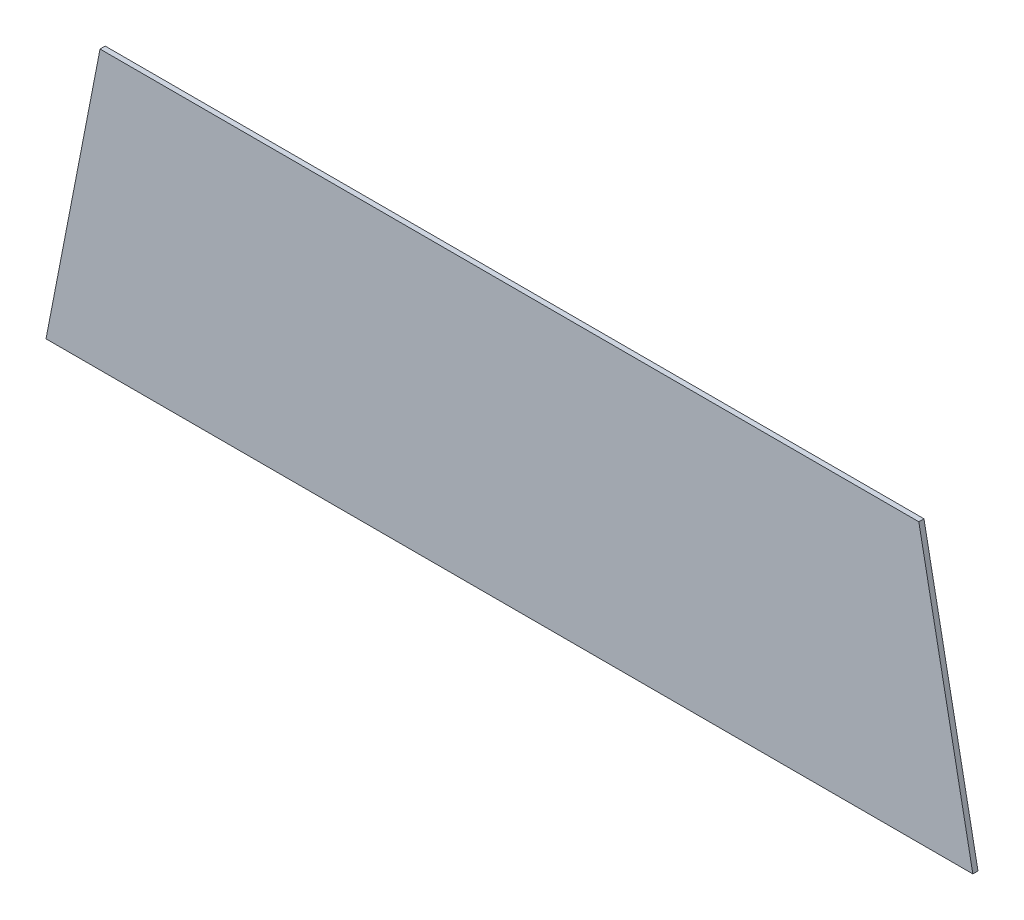
ISO-10303-21;
HEADER;
FILE_DESCRIPTION(('STEP AP214'),'2;1');
FILE_NAME('part.step','',(''),(''),'','','');
FILE_SCHEMA(('AUTOMOTIVE_DESIGN { 1 0 10303 214 1 1 1 1 }'));
ENDSEC;
DATA;
#1=APPLICATION_CONTEXT('core data for automotive mechanical design processes');
#2=APPLICATION_PROTOCOL_DEFINITION('international standard','automotive_design',2000,#1);
#3=PRODUCT_CONTEXT('',#1,'mechanical');
#4=PRODUCT('Part','Part','',(#3));
#5=PRODUCT_RELATED_PRODUCT_CATEGORY('part','',(#4));
#6=PRODUCT_DEFINITION_FORMATION('','',#4);
#7=PRODUCT_DEFINITION_CONTEXT('part definition',#1,'design');
#8=PRODUCT_DEFINITION('design','',#6,#7);
#9=PRODUCT_DEFINITION_SHAPE('','',#8);
#10=(LENGTH_UNIT() NAMED_UNIT(*) SI_UNIT(.MILLI.,.METRE.));
#11=(NAMED_UNIT(*) PLANE_ANGLE_UNIT() SI_UNIT($,.RADIAN.));
#12=(NAMED_UNIT(*) SI_UNIT($,.STERADIAN.) SOLID_ANGLE_UNIT());
#13=UNCERTAINTY_MEASURE_WITH_UNIT(LENGTH_MEASURE(1.E-05),#10,'distance_accuracy_value','');
#14=(GEOMETRIC_REPRESENTATION_CONTEXT(3) GLOBAL_UNCERTAINTY_ASSIGNED_CONTEXT((#13)) GLOBAL_UNIT_ASSIGNED_CONTEXT((#10,
#11,#12)) REPRESENTATION_CONTEXT('',''));
#15=CARTESIAN_POINT('',(0.,0.,0.));
#16=DIRECTION('',(0.,0.,1.));
#17=DIRECTION('',(1.,0.,0.));
#18=AXIS2_PLACEMENT_3D('',#15,#16,#17);
#19=CARTESIAN_POINT('',(-0.8999982,-0.26994612,0.01));
#20=DIRECTION('',(0.,0.,1.));
#21=DIRECTION('',(1.,0.,0.));
#22=AXIS2_PLACEMENT_3D('',#19,#20,#21);
#23=PLANE('',#22);
#24=DIRECTION('',(-1.,0.,0.));
#25=VECTOR('',#24,1.);
#26=CARTESIAN_POINT('',(-0.8999982,0.26994866,0.01));
#27=LINE('',#26,#25);
#28=CARTESIAN_POINT('',(0.79505556,0.26994866,0.01));
#29=VERTEX_POINT('',#28);
#30=CARTESIAN_POINT('',(-0.79505302,0.26994866,0.01));
#31=VERTEX_POINT('',#30);
#32=EDGE_CURVE('E107',#29,#31,#27,.T.);
#33=ORIENTED_EDGE('',*,*,#32,.T.);
#34=DIRECTION('',(-0.190809460987009,-0.981627092942043,0.));
#35=VECTOR('',#34,1.);
#36=CARTESIAN_POINT('',(-0.79505302,0.26994866,0.01));
#37=LINE('',#36,#35);
#38=CARTESIAN_POINT('',(-0.8999982,-0.26994612,0.01));
#39=VERTEX_POINT('',#38);
#40=EDGE_CURVE('E74',#31,#39,#37,.T.);
#41=ORIENTED_EDGE('',*,*,#40,.T.);
#42=DIRECTION('',(-1.,0.,0.));
#43=VECTOR('',#42,1.);
#44=CARTESIAN_POINT('',(0.90000074,-0.26994612,0.01));
#45=LINE('',#44,#43);
#46=CARTESIAN_POINT('',(0.90000074,-0.26994612,0.01));
#47=VERTEX_POINT('',#46);
#48=EDGE_CURVE('E11',#47,#39,#45,.T.);
#49=ORIENTED_EDGE('',*,*,#48,.F.);
#50=DIRECTION('',(-0.190809460987009,0.981627092942043,0.));
#51=VECTOR('',#50,1.);
#52=CARTESIAN_POINT('',(0.90000074,-0.26994612,0.01));
#53=LINE('',#52,#51);
#54=EDGE_CURVE('E27',#47,#29,#53,.T.);
#55=ORIENTED_EDGE('',*,*,#54,.T.);
#56=EDGE_LOOP('',(#33,#41,#49,#55));
#57=FACE_BOUND('',#56,.T.);
#58=ADVANCED_FACE('F16',(#57),#23,.T.);
#59=CARTESIAN_POINT('',(0.90000074,-0.26994612,0.));
#60=DIRECTION('',(0.,-1.,0.));
#61=DIRECTION('',(0.,0.,-1.));
#62=AXIS2_PLACEMENT_3D('',#59,#60,#61);
#63=PLANE('',#62);
#64=DIRECTION('',(0.,0.,1.));
#65=VECTOR('',#64,1.);
#66=CARTESIAN_POINT('',(-0.8999982,-0.26994612,0.));
#67=LINE('',#66,#65);
#68=CARTESIAN_POINT('',(-0.8999982,-0.26994612,0.));
#69=VERTEX_POINT('',#68);
#70=EDGE_CURVE('E76',#69,#39,#67,.T.);
#71=ORIENTED_EDGE('',*,*,#70,.F.);
#72=DIRECTION('',(1.,0.,0.));
#73=VECTOR('',#72,1.);
#74=CARTESIAN_POINT('',(-0.8999982,-0.26994612,0.));
#75=LINE('',#74,#73);
#76=CARTESIAN_POINT('',(0.90000074,-0.26994612,0.));
#77=VERTEX_POINT('',#76);
#78=EDGE_CURVE('E84',#69,#77,#75,.T.);
#79=ORIENTED_EDGE('',*,*,#78,.T.);
#80=DIRECTION('',(0.,0.,-1.));
#81=VECTOR('',#80,1.);
#82=CARTESIAN_POINT('',(0.90000074,-0.26994612,0.));
#83=LINE('',#82,#81);
#84=EDGE_CURVE('E97',#47,#77,#83,.T.);
#85=ORIENTED_EDGE('',*,*,#84,.F.);
#86=ORIENTED_EDGE('',*,*,#48,.T.);
#87=EDGE_LOOP('',(#71,#79,#85,#86));
#88=FACE_BOUND('',#87,.T.);
#89=ADVANCED_FACE('F124',(#88),#63,.T.);
#90=CARTESIAN_POINT('',(0.79505556,0.26994866,0.));
#91=DIRECTION('',(0.981627092942043,0.190809460987009,0.));
#92=DIRECTION('',(0.,0.,-1.));
#93=AXIS2_PLACEMENT_3D('',#90,#91,#92);
#94=PLANE('',#93);
#95=ORIENTED_EDGE('',*,*,#84,.T.);
#96=DIRECTION('',(-0.190809460987009,0.981627092942043,0.));
#97=VECTOR('',#96,1.);
#98=CARTESIAN_POINT('',(0.90000074,-0.26994612,0.));
#99=LINE('',#98,#97);
#100=CARTESIAN_POINT('',(0.79505556,0.26994866,0.));
#101=VERTEX_POINT('',#100);
#102=EDGE_CURVE('E88',#77,#101,#99,.T.);
#103=ORIENTED_EDGE('',*,*,#102,.T.);
#104=DIRECTION('',(0.,0.,-1.));
#105=VECTOR('',#104,1.);
#106=CARTESIAN_POINT('',(0.79505556,0.26994866,0.));
#107=LINE('',#106,#105);
#108=EDGE_CURVE('E20',#29,#101,#107,.T.);
#109=ORIENTED_EDGE('',*,*,#108,.F.);
#110=ORIENTED_EDGE('',*,*,#54,.F.);
#111=EDGE_LOOP('',(#95,#103,#109,#110));
#112=FACE_BOUND('',#111,.T.);
#113=ADVANCED_FACE('F122',(#112),#94,.T.);
#114=CARTESIAN_POINT('',(-0.79505302,0.26994866,0.));
#115=DIRECTION('',(0.,1.,0.));
#116=DIRECTION('',(1.,0.,0.));
#117=AXIS2_PLACEMENT_3D('',#114,#115,#116);
#118=PLANE('',#117);
#119=ORIENTED_EDGE('',*,*,#108,.T.);
#120=DIRECTION('',(-1.,0.,0.));
#121=VECTOR('',#120,1.);
#122=CARTESIAN_POINT('',(-0.8999982,0.26994866,0.));
#123=LINE('',#122,#121);
#124=CARTESIAN_POINT('',(-0.79505302,0.26994866,0.));
#125=VERTEX_POINT('',#124);
#126=EDGE_CURVE('E82',#101,#125,#123,.T.);
#127=ORIENTED_EDGE('',*,*,#126,.T.);
#128=DIRECTION('',(0.,0.,-1.));
#129=VECTOR('',#128,1.);
#130=CARTESIAN_POINT('',(-0.79505302,0.26994866,0.));
#131=LINE('',#130,#129);
#132=EDGE_CURVE('E69',#31,#125,#131,.T.);
#133=ORIENTED_EDGE('',*,*,#132,.F.);
#134=ORIENTED_EDGE('',*,*,#32,.F.);
#135=EDGE_LOOP('',(#119,#127,#133,#134));
#136=FACE_BOUND('',#135,.T.);
#137=ADVANCED_FACE('F86',(#136),#118,.T.);
#138=CARTESIAN_POINT('',(-0.8999982,-0.26994612,0.));
#139=DIRECTION('',(-0.981627092942043,0.190809460987009,0.));
#140=DIRECTION('',(0.,0.,1.));
#141=AXIS2_PLACEMENT_3D('',#138,#139,#140);
#142=PLANE('',#141);
#143=ORIENTED_EDGE('',*,*,#132,.T.);
#144=DIRECTION('',(-0.190809460987009,-0.981627092942043,0.));
#145=VECTOR('',#144,1.);
#146=CARTESIAN_POINT('',(-0.79505302,0.26994866,0.));
#147=LINE('',#146,#145);
#148=EDGE_CURVE('E72',#125,#69,#147,.T.);
#149=ORIENTED_EDGE('',*,*,#148,.T.);
#150=ORIENTED_EDGE('',*,*,#70,.T.);
#151=ORIENTED_EDGE('',*,*,#40,.F.);
#152=EDGE_LOOP('',(#143,#149,#150,#151));
#153=FACE_BOUND('',#152,.T.);
#154=ADVANCED_FACE('F18',(#153),#142,.T.);
#155=CARTESIAN_POINT('',(-0.8999982,-0.26994612,0.));
#156=DIRECTION('',(0.,0.,1.));
#157=DIRECTION('',(1.,0.,0.));
#158=AXIS2_PLACEMENT_3D('',#155,#156,#157);
#159=PLANE('',#158);
#160=ORIENTED_EDGE('',*,*,#126,.F.);
#161=ORIENTED_EDGE('',*,*,#102,.F.);
#162=ORIENTED_EDGE('',*,*,#78,.F.);
#163=ORIENTED_EDGE('',*,*,#148,.F.);
#164=EDGE_LOOP('',(#160,#161,#162,#163));
#165=FACE_BOUND('',#164,.T.);
#166=ADVANCED_FACE('F80',(#165),#159,.F.);
#167=CLOSED_SHELL('',(#58,#89,#113,#137,#154,#166));
#168=MANIFOLD_SOLID_BREP('B1',#167);
#169=ADVANCED_BREP_SHAPE_REPRESENTATION('',(#18,#168),#14);
#170=SHAPE_DEFINITION_REPRESENTATION(#9,#169);
ENDSEC;
END-ISO-10303-21;
